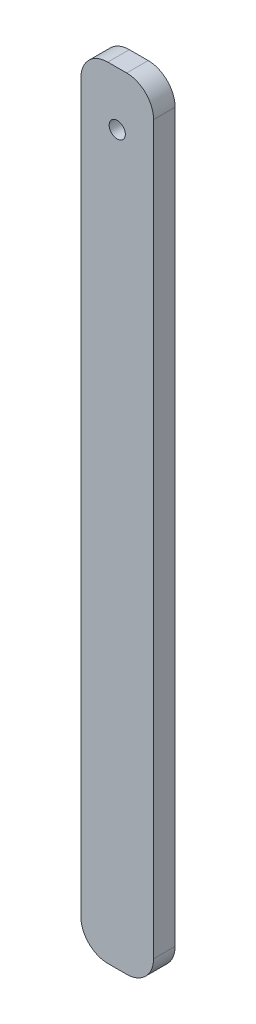
ISO-10303-21;
HEADER;
FILE_DESCRIPTION(('STEP AP214'),'2;1');
FILE_NAME('part.step','',(''),(''),'','','');
FILE_SCHEMA(('AUTOMOTIVE_DESIGN { 1 0 10303 214 1 1 1 1 }'));
ENDSEC;
DATA;
#1=APPLICATION_CONTEXT('core data for automotive mechanical design processes');
#2=APPLICATION_PROTOCOL_DEFINITION('international standard','automotive_design',2000,#1);
#3=PRODUCT_CONTEXT('',#1,'mechanical');
#4=PRODUCT('Part','Part','',(#3));
#5=PRODUCT_RELATED_PRODUCT_CATEGORY('part','',(#4));
#6=PRODUCT_DEFINITION_FORMATION('','',#4);
#7=PRODUCT_DEFINITION_CONTEXT('part definition',#1,'design');
#8=PRODUCT_DEFINITION('design','',#6,#7);
#9=PRODUCT_DEFINITION_SHAPE('','',#8);
#10=(LENGTH_UNIT() NAMED_UNIT(*) SI_UNIT(.MILLI.,.METRE.));
#11=(NAMED_UNIT(*) PLANE_ANGLE_UNIT() SI_UNIT($,.RADIAN.));
#12=(NAMED_UNIT(*) SI_UNIT($,.STERADIAN.) SOLID_ANGLE_UNIT());
#13=UNCERTAINTY_MEASURE_WITH_UNIT(LENGTH_MEASURE(1.E-05),#10,'distance_accuracy_value','');
#14=(GEOMETRIC_REPRESENTATION_CONTEXT(3) GLOBAL_UNCERTAINTY_ASSIGNED_CONTEXT((#13)) GLOBAL_UNIT_ASSIGNED_CONTEXT((#10,
#11,#12)) REPRESENTATION_CONTEXT('',''));
#15=CARTESIAN_POINT('',(0.,0.,0.));
#16=DIRECTION('',(0.,0.,1.));
#17=DIRECTION('',(1.,0.,0.));
#18=AXIS2_PLACEMENT_3D('',#15,#16,#17);
#19=CARTESIAN_POINT('',(3.5,135.,8.));
#20=DIRECTION('',(0.,0.,-1.));
#21=DIRECTION('',(-1.,0.,0.));
#22=AXIS2_PLACEMENT_3D('',#19,#20,#21);
#23=CYLINDRICAL_SURFACE('',#22,10.);
#24=CARTESIAN_POINT('',(3.5,135.,0.));
#25=DIRECTION('',(0.,0.,1.));
#26=DIRECTION('',(1.,0.,0.));
#27=AXIS2_PLACEMENT_3D('',#24,#25,#26);
#28=CIRCLE('',#27,10.);
#29=CARTESIAN_POINT('',(3.49999999999992,145.,0.));
#30=VERTEX_POINT('',#29);
#31=CARTESIAN_POINT('',(13.5,135.,0.));
#32=VERTEX_POINT('',#31);
#33=EDGE_CURVE('E131',#30,#32,#28,.F.);
#34=ORIENTED_EDGE('',*,*,#33,.F.);
#35=DIRECTION('',(0.,0.,-1.));
#36=VECTOR('',#35,1.);
#37=CARTESIAN_POINT('',(3.49999999999992,145.,8.));
#38=LINE('',#37,#36);
#39=CARTESIAN_POINT('',(3.49999999999992,145.,8.));
#40=VERTEX_POINT('',#39);
#41=EDGE_CURVE('E11',#40,#30,#38,.T.);
#42=ORIENTED_EDGE('',*,*,#41,.F.);
#43=CARTESIAN_POINT('',(3.5,135.,8.));
#44=DIRECTION('',(0.,0.,1.));
#45=DIRECTION('',(1.,0.,0.));
#46=AXIS2_PLACEMENT_3D('',#43,#44,#45);
#47=CIRCLE('',#46,10.);
#48=CARTESIAN_POINT('',(13.5,135.,8.));
#49=VERTEX_POINT('',#48);
#50=EDGE_CURVE('E153',#40,#49,#47,.F.);
#51=ORIENTED_EDGE('',*,*,#50,.T.);
#52=DIRECTION('',(0.,0.,-1.));
#53=VECTOR('',#52,1.);
#54=CARTESIAN_POINT('',(13.5,135.,8.));
#55=LINE('',#54,#53);
#56=EDGE_CURVE('E86',#49,#32,#55,.T.);
#57=ORIENTED_EDGE('',*,*,#56,.T.);
#58=EDGE_LOOP('',(#34,#42,#51,#57));
#59=FACE_BOUND('',#58,.T.);
#60=ADVANCED_FACE('F35',(#59),#23,.T.);
#61=CARTESIAN_POINT('',(0.,145.,8.));
#62=DIRECTION('',(0.,1.,0.));
#63=DIRECTION('',(0.,0.,1.));
#64=AXIS2_PLACEMENT_3D('',#61,#62,#63);
#65=PLANE('',#64);
#66=DIRECTION('',(1.,0.,0.));
#67=VECTOR('',#66,1.);
#68=CARTESIAN_POINT('',(0.,145.,0.));
#69=LINE('',#68,#67);
#70=CARTESIAN_POINT('',(-3.49999999999993,145.,0.));
#71=VERTEX_POINT('',#70);
#72=EDGE_CURVE('E134',#71,#30,#69,.T.);
#73=ORIENTED_EDGE('',*,*,#72,.F.);
#74=DIRECTION('',(0.,0.,-1.));
#75=VECTOR('',#74,1.);
#76=CARTESIAN_POINT('',(-3.49999999999993,145.,8.));
#77=LINE('',#76,#75);
#78=CARTESIAN_POINT('',(-3.49999999999993,145.,8.));
#79=VERTEX_POINT('',#78);
#80=EDGE_CURVE('E43',#79,#71,#77,.T.);
#81=ORIENTED_EDGE('',*,*,#80,.F.);
#82=DIRECTION('',(1.,0.,0.));
#83=VECTOR('',#82,1.);
#84=CARTESIAN_POINT('',(0.,145.,8.));
#85=LINE('',#84,#83);
#86=EDGE_CURVE('E180',#79,#40,#85,.T.);
#87=ORIENTED_EDGE('',*,*,#86,.T.);
#88=ORIENTED_EDGE('',*,*,#41,.T.);
#89=EDGE_LOOP('',(#73,#81,#87,#88));
#90=FACE_BOUND('',#89,.T.);
#91=ADVANCED_FACE('F170',(#90),#65,.T.);
#92=CARTESIAN_POINT('',(-3.5,135.,8.));
#93=DIRECTION('',(0.,0.,-1.));
#94=DIRECTION('',(-1.,0.,0.));
#95=AXIS2_PLACEMENT_3D('',#92,#93,#94);
#96=CYLINDRICAL_SURFACE('',#95,10.);
#97=CARTESIAN_POINT('',(-3.5,135.,0.));
#98=DIRECTION('',(0.,0.,1.));
#99=DIRECTION('',(1.,0.,0.));
#100=AXIS2_PLACEMENT_3D('',#97,#98,#99);
#101=CIRCLE('',#100,10.);
#102=CARTESIAN_POINT('',(-13.5,135.,0.));
#103=VERTEX_POINT('',#102);
#104=EDGE_CURVE('E137',#103,#71,#101,.F.);
#105=ORIENTED_EDGE('',*,*,#104,.F.);
#106=DIRECTION('',(0.,0.,-1.));
#107=VECTOR('',#106,1.);
#108=CARTESIAN_POINT('',(-13.5,135.,8.));
#109=LINE('',#108,#107);
#110=CARTESIAN_POINT('',(-13.5,135.,8.));
#111=VERTEX_POINT('',#110);
#112=EDGE_CURVE('E159',#111,#103,#109,.T.);
#113=ORIENTED_EDGE('',*,*,#112,.F.);
#114=CARTESIAN_POINT('',(-3.5,135.,8.));
#115=DIRECTION('',(0.,0.,1.));
#116=DIRECTION('',(1.,0.,0.));
#117=AXIS2_PLACEMENT_3D('',#114,#115,#116);
#118=CIRCLE('',#117,10.);
#119=EDGE_CURVE('E166',#111,#79,#118,.F.);
#120=ORIENTED_EDGE('',*,*,#119,.T.);
#121=ORIENTED_EDGE('',*,*,#80,.T.);
#122=EDGE_LOOP('',(#105,#113,#120,#121));
#123=FACE_BOUND('',#122,.T.);
#124=ADVANCED_FACE('F164',(#123),#96,.T.);
#125=CARTESIAN_POINT('',(-13.5,0.,8.));
#126=DIRECTION('',(-1.,0.,0.));
#127=DIRECTION('',(0.,0.,1.));
#128=AXIS2_PLACEMENT_3D('',#125,#126,#127);
#129=PLANE('',#128);
#130=DIRECTION('',(0.,1.,0.));
#131=VECTOR('',#130,1.);
#132=CARTESIAN_POINT('',(-13.5,0.,0.));
#133=LINE('',#132,#131);
#134=CARTESIAN_POINT('',(-13.5,-135.,0.));
#135=VERTEX_POINT('',#134);
#136=EDGE_CURVE('E140',#135,#103,#133,.T.);
#137=ORIENTED_EDGE('',*,*,#136,.F.);
#138=DIRECTION('',(0.,0.,-1.));
#139=VECTOR('',#138,1.);
#140=CARTESIAN_POINT('',(-13.5,-135.,8.));
#141=LINE('',#140,#139);
#142=CARTESIAN_POINT('',(-13.5,-135.,8.));
#143=VERTEX_POINT('',#142);
#144=EDGE_CURVE('E157',#143,#135,#141,.T.);
#145=ORIENTED_EDGE('',*,*,#144,.F.);
#146=DIRECTION('',(0.,1.,0.));
#147=VECTOR('',#146,1.);
#148=CARTESIAN_POINT('',(-13.5,0.,8.));
#149=LINE('',#148,#147);
#150=EDGE_CURVE('E179',#143,#111,#149,.T.);
#151=ORIENTED_EDGE('',*,*,#150,.T.);
#152=ORIENTED_EDGE('',*,*,#112,.T.);
#153=EDGE_LOOP('',(#137,#145,#151,#152));
#154=FACE_BOUND('',#153,.T.);
#155=ADVANCED_FACE('F177',(#154),#129,.T.);
#156=CARTESIAN_POINT('',(-3.5,-135.,8.));
#157=DIRECTION('',(0.,0.,-1.));
#158=DIRECTION('',(-1.,0.,0.));
#159=AXIS2_PLACEMENT_3D('',#156,#157,#158);
#160=CYLINDRICAL_SURFACE('',#159,10.);
#161=CARTESIAN_POINT('',(-3.5,-135.,0.));
#162=DIRECTION('',(0.,0.,1.));
#163=DIRECTION('',(1.,0.,0.));
#164=AXIS2_PLACEMENT_3D('',#161,#162,#163);
#165=CIRCLE('',#164,10.);
#166=CARTESIAN_POINT('',(-3.49999999999993,-145.,0.));
#167=VERTEX_POINT('',#166);
#168=EDGE_CURVE('E143',#167,#135,#165,.F.);
#169=ORIENTED_EDGE('',*,*,#168,.F.);
#170=DIRECTION('',(0.,0.,-1.));
#171=VECTOR('',#170,1.);
#172=CARTESIAN_POINT('',(-3.49999999999993,-145.,8.));
#173=LINE('',#172,#171);
#174=CARTESIAN_POINT('',(-3.49999999999993,-145.,8.));
#175=VERTEX_POINT('',#174);
#176=EDGE_CURVE('E120',#175,#167,#173,.T.);
#177=ORIENTED_EDGE('',*,*,#176,.F.);
#178=CARTESIAN_POINT('',(-3.5,-135.,8.));
#179=DIRECTION('',(0.,0.,1.));
#180=DIRECTION('',(1.,0.,0.));
#181=AXIS2_PLACEMENT_3D('',#178,#179,#180);
#182=CIRCLE('',#181,10.);
#183=EDGE_CURVE('E113',#175,#143,#182,.F.);
#184=ORIENTED_EDGE('',*,*,#183,.T.);
#185=ORIENTED_EDGE('',*,*,#144,.T.);
#186=EDGE_LOOP('',(#169,#177,#184,#185));
#187=FACE_BOUND('',#186,.T.);
#188=ADVANCED_FACE('F186',(#187),#160,.T.);
#189=CARTESIAN_POINT('',(0.,-145.,8.));
#190=DIRECTION('',(0.,1.,0.));
#191=DIRECTION('',(0.,0.,1.));
#192=AXIS2_PLACEMENT_3D('',#189,#190,#191);
#193=PLANE('',#192);
#194=DIRECTION('',(1.,0.,0.));
#195=VECTOR('',#194,1.);
#196=CARTESIAN_POINT('',(0.,-145.,0.));
#197=LINE('',#196,#195);
#198=CARTESIAN_POINT('',(3.49999999999992,-145.,0.));
#199=VERTEX_POINT('',#198);
#200=EDGE_CURVE('E119',#167,#199,#197,.T.);
#201=ORIENTED_EDGE('',*,*,#200,.T.);
#202=DIRECTION('',(0.,0.,-1.));
#203=VECTOR('',#202,1.);
#204=CARTESIAN_POINT('',(3.49999999999992,-145.,8.));
#205=LINE('',#204,#203);
#206=CARTESIAN_POINT('',(3.49999999999992,-145.,8.));
#207=VERTEX_POINT('',#206);
#208=EDGE_CURVE('E116',#207,#199,#205,.T.);
#209=ORIENTED_EDGE('',*,*,#208,.F.);
#210=DIRECTION('',(1.,0.,0.));
#211=VECTOR('',#210,1.);
#212=CARTESIAN_POINT('',(0.,-145.,8.));
#213=LINE('',#212,#211);
#214=EDGE_CURVE('E105',#175,#207,#213,.T.);
#215=ORIENTED_EDGE('',*,*,#214,.F.);
#216=ORIENTED_EDGE('',*,*,#176,.T.);
#217=EDGE_LOOP('',(#201,#209,#215,#216));
#218=FACE_BOUND('',#217,.T.);
#219=ADVANCED_FACE('F117',(#218),#193,.F.);
#220=CARTESIAN_POINT('',(3.5,-135.,8.));
#221=DIRECTION('',(0.,0.,-1.));
#222=DIRECTION('',(-1.,0.,0.));
#223=AXIS2_PLACEMENT_3D('',#220,#221,#222);
#224=CYLINDRICAL_SURFACE('',#223,10.);
#225=CARTESIAN_POINT('',(3.5,-135.,0.));
#226=DIRECTION('',(0.,0.,1.));
#227=DIRECTION('',(1.,0.,0.));
#228=AXIS2_PLACEMENT_3D('',#225,#226,#227);
#229=CIRCLE('',#228,10.);
#230=CARTESIAN_POINT('',(13.5,-135.,0.));
#231=VERTEX_POINT('',#230);
#232=EDGE_CURVE('E79',#199,#231,#229,.T.);
#233=ORIENTED_EDGE('',*,*,#232,.T.);
#234=DIRECTION('',(0.,0.,-1.));
#235=VECTOR('',#234,1.);
#236=CARTESIAN_POINT('',(13.5,-135.,8.));
#237=LINE('',#236,#235);
#238=CARTESIAN_POINT('',(13.5,-135.,8.));
#239=VERTEX_POINT('',#238);
#240=EDGE_CURVE('E121',#239,#231,#237,.T.);
#241=ORIENTED_EDGE('',*,*,#240,.F.);
#242=CARTESIAN_POINT('',(3.5,-135.,8.));
#243=DIRECTION('',(0.,0.,1.));
#244=DIRECTION('',(1.,0.,0.));
#245=AXIS2_PLACEMENT_3D('',#242,#243,#244);
#246=CIRCLE('',#245,10.);
#247=EDGE_CURVE('E110',#207,#239,#246,.T.);
#248=ORIENTED_EDGE('',*,*,#247,.F.);
#249=ORIENTED_EDGE('',*,*,#208,.T.);
#250=EDGE_LOOP('',(#233,#241,#248,#249));
#251=FACE_BOUND('',#250,.T.);
#252=ADVANCED_FACE('F123',(#251),#224,.T.);
#253=CARTESIAN_POINT('',(13.5,0.,8.));
#254=DIRECTION('',(-1.,0.,0.));
#255=DIRECTION('',(0.,0.,1.));
#256=AXIS2_PLACEMENT_3D('',#253,#254,#255);
#257=PLANE('',#256);
#258=DIRECTION('',(0.,1.,0.));
#259=VECTOR('',#258,1.);
#260=CARTESIAN_POINT('',(13.5,0.,0.));
#261=LINE('',#260,#259);
#262=EDGE_CURVE('E148',#231,#32,#261,.T.);
#263=ORIENTED_EDGE('',*,*,#262,.T.);
#264=ORIENTED_EDGE('',*,*,#56,.F.);
#265=DIRECTION('',(0.,1.,0.));
#266=VECTOR('',#265,1.);
#267=CARTESIAN_POINT('',(13.5,0.,8.));
#268=LINE('',#267,#266);
#269=EDGE_CURVE('E51',#239,#49,#268,.T.);
#270=ORIENTED_EDGE('',*,*,#269,.F.);
#271=ORIENTED_EDGE('',*,*,#240,.T.);
#272=EDGE_LOOP('',(#263,#264,#270,#271));
#273=FACE_BOUND('',#272,.T.);
#274=ADVANCED_FACE('F189',(#273),#257,.F.);
#275=CARTESIAN_POINT('',(0.,125.,8.));
#276=DIRECTION('',(0.,0.,-1.));
#277=DIRECTION('',(-1.,0.,0.));
#278=AXIS2_PLACEMENT_3D('',#275,#276,#277);
#279=CYLINDRICAL_SURFACE('',#278,2.99999999999999);
#280=CARTESIAN_POINT('',(0.,125.,8.));
#281=DIRECTION('',(0.,0.,1.));
#282=DIRECTION('',(1.,0.,0.));
#283=AXIS2_PLACEMENT_3D('',#280,#281,#282);
#284=CIRCLE('',#283,2.99999999999999);
#285=CARTESIAN_POINT('',(2.99999999999999,125.,8.));
#286=VERTEX_POINT('',#285);
#287=EDGE_CURVE('E125',#286,#286,#284,.T.);
#288=ORIENTED_EDGE('',*,*,#287,.T.);
#289=EDGE_LOOP('',(#288));
#290=FACE_BOUND('',#289,.T.);
#291=CARTESIAN_POINT('',(0.,125.,0.));
#292=DIRECTION('',(0.,0.,1.));
#293=DIRECTION('',(1.,0.,0.));
#294=AXIS2_PLACEMENT_3D('',#291,#292,#293);
#295=CIRCLE('',#294,2.99999999999999);
#296=CARTESIAN_POINT('',(2.99999999999999,125.,0.));
#297=VERTEX_POINT('',#296);
#298=EDGE_CURVE('E150',#297,#297,#295,.T.);
#299=ORIENTED_EDGE('',*,*,#298,.F.);
#300=EDGE_LOOP('',(#299));
#301=FACE_BOUND('',#300,.T.);
#302=ADVANCED_FACE('F209',(#290,#301),#279,.F.);
#303=CARTESIAN_POINT('',(0.,0.,8.));
#304=DIRECTION('',(0.,0.,1.));
#305=DIRECTION('',(1.,0.,0.));
#306=AXIS2_PLACEMENT_3D('',#303,#304,#305);
#307=PLANE('',#306);
#308=ORIENTED_EDGE('',*,*,#50,.F.);
#309=ORIENTED_EDGE('',*,*,#86,.F.);
#310=ORIENTED_EDGE('',*,*,#119,.F.);
#311=ORIENTED_EDGE('',*,*,#150,.F.);
#312=ORIENTED_EDGE('',*,*,#183,.F.);
#313=ORIENTED_EDGE('',*,*,#214,.T.);
#314=ORIENTED_EDGE('',*,*,#247,.T.);
#315=ORIENTED_EDGE('',*,*,#269,.T.);
#316=EDGE_LOOP('',(#308,#309,#310,#311,#312,#313,#314,#315));
#317=FACE_BOUND('',#316,.T.);
#318=ORIENTED_EDGE('',*,*,#287,.F.);
#319=EDGE_LOOP('',(#318));
#320=FACE_BOUND('',#319,.T.);
#321=ADVANCED_FACE('F107',(#317,#320),#307,.T.);
#322=CARTESIAN_POINT('',(0.,0.,0.));
#323=DIRECTION('',(0.,0.,1.));
#324=DIRECTION('',(1.,0.,0.));
#325=AXIS2_PLACEMENT_3D('',#322,#323,#324);
#326=PLANE('',#325);
#327=ORIENTED_EDGE('',*,*,#33,.T.);
#328=ORIENTED_EDGE('',*,*,#262,.F.);
#329=ORIENTED_EDGE('',*,*,#232,.F.);
#330=ORIENTED_EDGE('',*,*,#200,.F.);
#331=ORIENTED_EDGE('',*,*,#168,.T.);
#332=ORIENTED_EDGE('',*,*,#136,.T.);
#333=ORIENTED_EDGE('',*,*,#104,.T.);
#334=ORIENTED_EDGE('',*,*,#72,.T.);
#335=EDGE_LOOP('',(#327,#328,#329,#330,#331,#332,#333,#334));
#336=FACE_BOUND('',#335,.T.);
#337=ORIENTED_EDGE('',*,*,#298,.T.);
#338=EDGE_LOOP('',(#337));
#339=FACE_BOUND('',#338,.T.);
#340=ADVANCED_FACE('F172',(#336,#339),#326,.F.);
#341=CLOSED_SHELL('',(#60,#91,#124,#155,#188,#219,#252,#274,#302,#321,#340));
#342=MANIFOLD_SOLID_BREP('B2',#341);
#343=ADVANCED_BREP_SHAPE_REPRESENTATION('',(#18,#342),#14);
#344=SHAPE_DEFINITION_REPRESENTATION(#9,#343);
ENDSEC;
END-ISO-10303-21;
